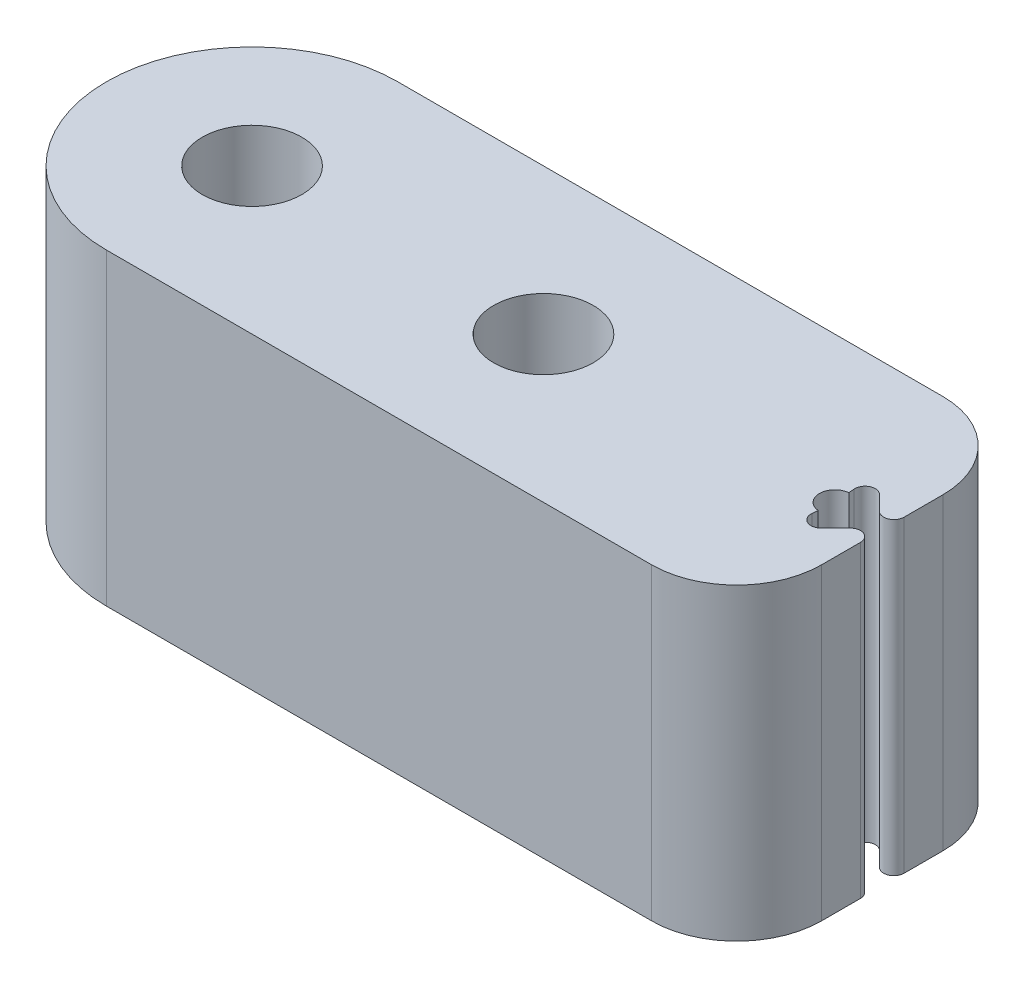
ISO-10303-21;
HEADER;
FILE_DESCRIPTION(('STEP AP214'),'2;1');
FILE_NAME('part.step','',(''),(''),'','','');
FILE_SCHEMA(('AUTOMOTIVE_DESIGN { 1 0 10303 214 1 1 1 1 }'));
ENDSEC;
DATA;
#1=APPLICATION_CONTEXT('core data for automotive mechanical design processes');
#2=APPLICATION_PROTOCOL_DEFINITION('international standard','automotive_design',2000,#1);
#3=PRODUCT_CONTEXT('',#1,'mechanical');
#4=PRODUCT('Part','Part','',(#3));
#5=PRODUCT_RELATED_PRODUCT_CATEGORY('part','',(#4));
#6=PRODUCT_DEFINITION_FORMATION('','',#4);
#7=PRODUCT_DEFINITION_CONTEXT('part definition',#1,'design');
#8=PRODUCT_DEFINITION('design','',#6,#7);
#9=PRODUCT_DEFINITION_SHAPE('','',#8);
#10=(LENGTH_UNIT() NAMED_UNIT(*) SI_UNIT(.MILLI.,.METRE.));
#11=(NAMED_UNIT(*) PLANE_ANGLE_UNIT() SI_UNIT($,.RADIAN.));
#12=(NAMED_UNIT(*) SI_UNIT($,.STERADIAN.) SOLID_ANGLE_UNIT());
#13=UNCERTAINTY_MEASURE_WITH_UNIT(LENGTH_MEASURE(1.E-05),#10,'distance_accuracy_value','');
#14=(GEOMETRIC_REPRESENTATION_CONTEXT(3) GLOBAL_UNCERTAINTY_ASSIGNED_CONTEXT((#13)) GLOBAL_UNIT_ASSIGNED_CONTEXT((#10,
#11,#12)) REPRESENTATION_CONTEXT('',''));
#15=CARTESIAN_POINT('',(0.,0.,0.));
#16=DIRECTION('',(0.,0.,1.));
#17=DIRECTION('',(1.,0.,0.));
#18=AXIS2_PLACEMENT_3D('',#15,#16,#17);
#19=CARTESIAN_POINT('',(-4.,12.7,0.));
#20=DIRECTION('',(0.,1.,0.));
#21=DIRECTION('',(0.,0.,1.));
#22=AXIS2_PLACEMENT_3D('',#19,#20,#21);
#23=PLANE('',#22);
#24=CARTESIAN_POINT('',(-16.,12.7,0.));
#25=DIRECTION('',(0.,1.,0.));
#26=DIRECTION('',(0.,0.,1.));
#27=AXIS2_PLACEMENT_3D('',#24,#25,#26);
#28=CIRCLE('',#27,2.05);
#29=CARTESIAN_POINT('',(-16.,12.7,2.05));
#30=VERTEX_POINT('',#29);
#31=EDGE_CURVE('E194',#30,#30,#28,.T.);
#32=ORIENTED_EDGE('',*,*,#31,.F.);
#33=EDGE_LOOP('',(#32));
#34=FACE_BOUND('',#33,.T.);
#35=CARTESIAN_POINT('',(-4.,12.7,0.));
#36=DIRECTION('',(0.,-1.,0.));
#37=DIRECTION('',(0.,0.,1.));
#38=AXIS2_PLACEMENT_3D('',#35,#36,#37);
#39=CIRCLE('',#38,0.634999999999999);
#40=CARTESIAN_POINT('',(-4.05534389664477,12.7,0.632583633288258));
#41=VERTEX_POINT('',#40);
#42=CARTESIAN_POINT('',(-4.05534389664477,12.7,-0.632583633288257));
#43=VERTEX_POINT('',#42);
#44=EDGE_CURVE('E236',#41,#43,#39,.T.);
#45=ORIENTED_EDGE('',*,*,#44,.T.);
#46=DIRECTION('',(-0.0871557427476667,0.,-0.996194698091745));
#47=VECTOR('',#46,1.);
#48=CARTESIAN_POINT('',(-4.05534389664477,12.7,-0.632583633288257));
#49=LINE('',#48,#47);
#50=CARTESIAN_POINT('',(-4.07584445948414,12.7,-0.866906138778301));
#51=VERTEX_POINT('',#50);
#52=EDGE_CURVE('E124',#43,#51,#49,.T.);
#53=ORIENTED_EDGE('',*,*,#52,.T.);
#54=CARTESIAN_POINT('',(-3.65806528884882,12.7,-0.903457080066159));
#55=DIRECTION('',(0.,-1.,0.));
#56=DIRECTION('',(0.,0.,-1.));
#57=AXIS2_PLACEMENT_3D('',#54,#55,#56);
#58=CIRCLE('',#57,0.419375019196146);
#59=CARTESIAN_POINT('',(-3.36152236891499,12.7,-1.2));
#60=VERTEX_POINT('',#59);
#61=EDGE_CURVE('E289',#51,#60,#58,.T.);
#62=ORIENTED_EDGE('',*,*,#61,.T.);
#63=DIRECTION('',(0.707106781186566,0.,0.707106781186529));
#64=VECTOR('',#63,1.);
#65=CARTESIAN_POINT('',(-3.36152236891499,12.7,-1.2));
#66=LINE('',#65,#64);
#67=CARTESIAN_POINT('',(-2.76152236891496,12.7,-0.6));
#68=VERTEX_POINT('',#67);
#69=EDGE_CURVE('E309',#60,#68,#66,.T.);
#70=ORIENTED_EDGE('',*,*,#69,.T.);
#71=CARTESIAN_POINT('',(-2.46497944898113,12.7,-0.89654291993384));
#72=DIRECTION('',(0.,1.,0.));
#73=DIRECTION('',(0.,0.,1.));
#74=AXIS2_PLACEMENT_3D('',#71,#72,#73);
#75=CIRCLE('',#74,0.419375019196146);
#76=CARTESIAN_POINT('',(-2.04560442978499,12.7,-0.89654291993384));
#77=VERTEX_POINT('',#76);
#78=EDGE_CURVE('E305',#68,#77,#75,.T.);
#79=ORIENTED_EDGE('',*,*,#78,.T.);
#80=DIRECTION('',(0.,0.,-1.));
#81=VECTOR('',#80,1.);
#82=CARTESIAN_POINT('',(-2.04560442978499,12.7,-0.89654291993384));
#83=LINE('',#82,#81);
#84=CARTESIAN_POINT('',(-2.04560442978499,12.7,-2.5));
#85=VERTEX_POINT('',#84);
#86=EDGE_CURVE('E308',#77,#85,#83,.T.);
#87=ORIENTED_EDGE('',*,*,#86,.T.);
#88=CARTESIAN_POINT('',(-5.54560442978499,12.7,-2.5));
#89=DIRECTION('',(0.,1.,0.));
#90=DIRECTION('',(0.,0.,1.));
#91=AXIS2_PLACEMENT_3D('',#88,#89,#90);
#92=CIRCLE('',#91,3.5);
#93=CARTESIAN_POINT('',(-5.54560442978499,12.7,-6.));
#94=VERTEX_POINT('',#93);
#95=EDGE_CURVE('E313',#85,#94,#92,.T.);
#96=ORIENTED_EDGE('',*,*,#95,.T.);
#97=DIRECTION('',(-1.,0.,0.));
#98=VECTOR('',#97,1.);
#99=CARTESIAN_POINT('',(-5.54560442978499,12.7,-6.));
#100=LINE('',#99,#98);
#101=CARTESIAN_POINT('',(-28.,12.7,-6.));
#102=VERTEX_POINT('',#101);
#103=EDGE_CURVE('E320',#94,#102,#100,.T.);
#104=ORIENTED_EDGE('',*,*,#103,.T.);
#105=CARTESIAN_POINT('',(-28.,12.7,0.));
#106=DIRECTION('',(0.,1.,0.));
#107=DIRECTION('',(0.,0.,1.));
#108=AXIS2_PLACEMENT_3D('',#105,#106,#107);
#109=CIRCLE('',#108,6.);
#110=CARTESIAN_POINT('',(-28.,12.7,6.));
#111=VERTEX_POINT('',#110);
#112=EDGE_CURVE('E323',#102,#111,#109,.T.);
#113=ORIENTED_EDGE('',*,*,#112,.T.);
#114=DIRECTION('',(1.,0.,0.));
#115=VECTOR('',#114,1.);
#116=CARTESIAN_POINT('',(-28.,12.7,6.));
#117=LINE('',#116,#115);
#118=CARTESIAN_POINT('',(-5.54560442978499,12.7,6.));
#119=VERTEX_POINT('',#118);
#120=EDGE_CURVE('E326',#111,#119,#117,.T.);
#121=ORIENTED_EDGE('',*,*,#120,.T.);
#122=CARTESIAN_POINT('',(-5.54560442978499,12.7,2.5));
#123=DIRECTION('',(0.,1.,0.));
#124=DIRECTION('',(0.,0.,1.));
#125=AXIS2_PLACEMENT_3D('',#122,#123,#124);
#126=CIRCLE('',#125,3.5);
#127=CARTESIAN_POINT('',(-2.04560442978499,12.7,2.5));
#128=VERTEX_POINT('',#127);
#129=EDGE_CURVE('E329',#119,#128,#126,.T.);
#130=ORIENTED_EDGE('',*,*,#129,.T.);
#131=DIRECTION('',(0.,0.,-1.));
#132=VECTOR('',#131,1.);
#133=CARTESIAN_POINT('',(-2.04560442978499,12.7,0.896542919933841));
#134=LINE('',#133,#132);
#135=CARTESIAN_POINT('',(-2.04560442978499,12.7,0.896542919933841));
#136=VERTEX_POINT('',#135);
#137=EDGE_CURVE('E332',#128,#136,#134,.T.);
#138=ORIENTED_EDGE('',*,*,#137,.T.);
#139=CARTESIAN_POINT('',(-2.46497944898113,12.7,0.896542919933841));
#140=DIRECTION('',(0.,1.,0.));
#141=DIRECTION('',(0.,0.,-1.));
#142=AXIS2_PLACEMENT_3D('',#139,#140,#141);
#143=CIRCLE('',#142,0.419375019196146);
#144=CARTESIAN_POINT('',(-2.76152236891496,12.7,0.6));
#145=VERTEX_POINT('',#144);
#146=EDGE_CURVE('E167',#136,#145,#143,.T.);
#147=ORIENTED_EDGE('',*,*,#146,.T.);
#148=DIRECTION('',(-0.707106781186565,0.,0.70710678118653));
#149=VECTOR('',#148,1.);
#150=CARTESIAN_POINT('',(-3.36152236891499,12.7,1.2));
#151=LINE('',#150,#149);
#152=CARTESIAN_POINT('',(-3.36152236891499,12.7,1.2));
#153=VERTEX_POINT('',#152);
#154=EDGE_CURVE('E161',#145,#153,#151,.T.);
#155=ORIENTED_EDGE('',*,*,#154,.T.);
#156=CARTESIAN_POINT('',(-3.65806528884882,12.7,0.903457080066159));
#157=DIRECTION('',(0.,-1.,0.));
#158=DIRECTION('',(0.,0.,1.));
#159=AXIS2_PLACEMENT_3D('',#156,#157,#158);
#160=CIRCLE('',#159,0.419375019196146);
#161=CARTESIAN_POINT('',(-4.07584445948414,12.7,0.866906138778302));
#162=VERTEX_POINT('',#161);
#163=EDGE_CURVE('E165',#153,#162,#160,.T.);
#164=ORIENTED_EDGE('',*,*,#163,.T.);
#165=DIRECTION('',(0.0871557427476667,0.,-0.996194698091745));
#166=VECTOR('',#165,1.);
#167=CARTESIAN_POINT('',(-4.05534389664477,12.7,0.632583633288258));
#168=LINE('',#167,#166);
#169=EDGE_CURVE('E57',#162,#41,#168,.T.);
#170=ORIENTED_EDGE('',*,*,#169,.T.);
#171=EDGE_LOOP('',(#45,#53,#62,#70,#79,#87,#96,#104,#113,#121,#130,#138,#147,#155,#164,#170));
#172=FACE_BOUND('',#171,.T.);
#173=CARTESIAN_POINT('',(-28.,12.7,0.));
#174=DIRECTION('',(0.,1.,0.));
#175=DIRECTION('',(0.,0.,1.));
#176=AXIS2_PLACEMENT_3D('',#173,#174,#175);
#177=CIRCLE('',#176,2.05);
#178=CARTESIAN_POINT('',(-28.,12.7,2.05));
#179=VERTEX_POINT('',#178);
#180=EDGE_CURVE('E376',#179,#179,#177,.T.);
#181=ORIENTED_EDGE('',*,*,#180,.F.);
#182=EDGE_LOOP('',(#181));
#183=FACE_BOUND('',#182,.T.);
#184=ADVANCED_FACE('F39',(#34,#172,#183),#23,.T.);
#185=CARTESIAN_POINT('',(-4.,0.,0.));
#186=DIRECTION('',(0.,1.,0.));
#187=DIRECTION('',(0.,0.,1.));
#188=AXIS2_PLACEMENT_3D('',#185,#186,#187);
#189=PLANE('',#188);
#190=CARTESIAN_POINT('',(-4.,0.,0.));
#191=DIRECTION('',(0.,-1.,0.));
#192=DIRECTION('',(0.,0.,1.));
#193=AXIS2_PLACEMENT_3D('',#190,#191,#192);
#194=CIRCLE('',#193,0.634999999999999);
#195=CARTESIAN_POINT('',(-4.05534389664477,0.,0.632583633288258));
#196=VERTEX_POINT('',#195);
#197=CARTESIAN_POINT('',(-4.05534389664477,0.,-0.632583633288257));
#198=VERTEX_POINT('',#197);
#199=EDGE_CURVE('E189',#196,#198,#194,.T.);
#200=ORIENTED_EDGE('',*,*,#199,.F.);
#201=DIRECTION('',(0.0871557427476667,0.,-0.996194698091745));
#202=VECTOR('',#201,1.);
#203=CARTESIAN_POINT('',(-4.05534389664477,0.,0.632583633288258));
#204=LINE('',#203,#202);
#205=CARTESIAN_POINT('',(-4.07584445948414,0.,0.866906138778302));
#206=VERTEX_POINT('',#205);
#207=EDGE_CURVE('E116',#206,#196,#204,.T.);
#208=ORIENTED_EDGE('',*,*,#207,.F.);
#209=CARTESIAN_POINT('',(-3.65806528884882,0.,0.903457080066159));
#210=DIRECTION('',(0.,-1.,0.));
#211=DIRECTION('',(0.,0.,1.));
#212=AXIS2_PLACEMENT_3D('',#209,#210,#211);
#213=CIRCLE('',#212,0.419375019196146);
#214=CARTESIAN_POINT('',(-3.36152236891499,0.,1.2));
#215=VERTEX_POINT('',#214);
#216=EDGE_CURVE('E110',#215,#206,#213,.T.);
#217=ORIENTED_EDGE('',*,*,#216,.F.);
#218=DIRECTION('',(-0.707106781186565,0.,0.70710678118653));
#219=VECTOR('',#218,1.);
#220=CARTESIAN_POINT('',(-3.36152236891499,0.,1.2));
#221=LINE('',#220,#219);
#222=CARTESIAN_POINT('',(-2.76152236891496,0.,0.6));
#223=VERTEX_POINT('',#222);
#224=EDGE_CURVE('E176',#223,#215,#221,.T.);
#225=ORIENTED_EDGE('',*,*,#224,.F.);
#226=CARTESIAN_POINT('',(-2.46497944898113,0.,0.896542919933841));
#227=DIRECTION('',(0.,1.,0.));
#228=DIRECTION('',(0.,0.,-1.));
#229=AXIS2_PLACEMENT_3D('',#226,#227,#228);
#230=CIRCLE('',#229,0.419375019196146);
#231=CARTESIAN_POINT('',(-2.04560442978499,0.,0.896542919933841));
#232=VERTEX_POINT('',#231);
#233=EDGE_CURVE('E227',#232,#223,#230,.T.);
#234=ORIENTED_EDGE('',*,*,#233,.F.);
#235=DIRECTION('',(0.,0.,-1.));
#236=VECTOR('',#235,1.);
#237=CARTESIAN_POINT('',(-2.04560442978499,0.,0.896542919933841));
#238=LINE('',#237,#236);
#239=CARTESIAN_POINT('',(-2.04560442978499,0.,2.5));
#240=VERTEX_POINT('',#239);
#241=EDGE_CURVE('E224',#240,#232,#238,.T.);
#242=ORIENTED_EDGE('',*,*,#241,.F.);
#243=CARTESIAN_POINT('',(-5.54560442978499,0.,2.5));
#244=DIRECTION('',(0.,1.,0.));
#245=DIRECTION('',(0.,0.,1.));
#246=AXIS2_PLACEMENT_3D('',#243,#244,#245);
#247=CIRCLE('',#246,3.5);
#248=CARTESIAN_POINT('',(-5.54560442978499,0.,6.));
#249=VERTEX_POINT('',#248);
#250=EDGE_CURVE('E221',#249,#240,#247,.T.);
#251=ORIENTED_EDGE('',*,*,#250,.F.);
#252=DIRECTION('',(1.,0.,0.));
#253=VECTOR('',#252,1.);
#254=CARTESIAN_POINT('',(-28.,0.,6.));
#255=LINE('',#254,#253);
#256=CARTESIAN_POINT('',(-28.,0.,6.));
#257=VERTEX_POINT('',#256);
#258=EDGE_CURVE('E218',#257,#249,#255,.T.);
#259=ORIENTED_EDGE('',*,*,#258,.F.);
#260=CARTESIAN_POINT('',(-28.,0.,0.));
#261=DIRECTION('',(0.,1.,0.));
#262=DIRECTION('',(0.,0.,1.));
#263=AXIS2_PLACEMENT_3D('',#260,#261,#262);
#264=CIRCLE('',#263,6.);
#265=CARTESIAN_POINT('',(-28.,0.,-6.));
#266=VERTEX_POINT('',#265);
#267=EDGE_CURVE('E215',#266,#257,#264,.T.);
#268=ORIENTED_EDGE('',*,*,#267,.F.);
#269=DIRECTION('',(-1.,0.,0.));
#270=VECTOR('',#269,1.);
#271=CARTESIAN_POINT('',(-5.54560442978499,0.,-6.));
#272=LINE('',#271,#270);
#273=CARTESIAN_POINT('',(-5.54560442978499,0.,-6.));
#274=VERTEX_POINT('',#273);
#275=EDGE_CURVE('E212',#274,#266,#272,.T.);
#276=ORIENTED_EDGE('',*,*,#275,.F.);
#277=CARTESIAN_POINT('',(-5.54560442978499,0.,-2.5));
#278=DIRECTION('',(0.,1.,0.));
#279=DIRECTION('',(0.,0.,1.));
#280=AXIS2_PLACEMENT_3D('',#277,#278,#279);
#281=CIRCLE('',#280,3.5);
#282=CARTESIAN_POINT('',(-2.04560442978499,0.,-2.5));
#283=VERTEX_POINT('',#282);
#284=EDGE_CURVE('E209',#283,#274,#281,.T.);
#285=ORIENTED_EDGE('',*,*,#284,.F.);
#286=DIRECTION('',(0.,0.,-1.));
#287=VECTOR('',#286,1.);
#288=CARTESIAN_POINT('',(-2.04560442978499,0.,-0.89654291993384));
#289=LINE('',#288,#287);
#290=CARTESIAN_POINT('',(-2.04560442978499,0.,-0.89654291993384));
#291=VERTEX_POINT('',#290);
#292=EDGE_CURVE('E206',#291,#283,#289,.T.);
#293=ORIENTED_EDGE('',*,*,#292,.F.);
#294=CARTESIAN_POINT('',(-2.46497944898113,0.,-0.89654291993384));
#295=DIRECTION('',(0.,1.,0.));
#296=DIRECTION('',(0.,0.,1.));
#297=AXIS2_PLACEMENT_3D('',#294,#295,#296);
#298=CIRCLE('',#297,0.419375019196146);
#299=CARTESIAN_POINT('',(-2.76152236891496,0.,-0.6));
#300=VERTEX_POINT('',#299);
#301=EDGE_CURVE('E203',#300,#291,#298,.T.);
#302=ORIENTED_EDGE('',*,*,#301,.F.);
#303=DIRECTION('',(0.707106781186566,0.,0.707106781186529));
#304=VECTOR('',#303,1.);
#305=CARTESIAN_POINT('',(-3.36152236891499,0.,-1.2));
#306=LINE('',#305,#304);
#307=CARTESIAN_POINT('',(-3.36152236891499,0.,-1.2));
#308=VERTEX_POINT('',#307);
#309=EDGE_CURVE('E200',#308,#300,#306,.T.);
#310=ORIENTED_EDGE('',*,*,#309,.F.);
#311=CARTESIAN_POINT('',(-3.65806528884882,0.,-0.903457080066159));
#312=DIRECTION('',(0.,-1.,0.));
#313=DIRECTION('',(0.,0.,-1.));
#314=AXIS2_PLACEMENT_3D('',#311,#312,#313);
#315=CIRCLE('',#314,0.419375019196146);
#316=CARTESIAN_POINT('',(-4.07584445948414,0.,-0.866906138778301));
#317=VERTEX_POINT('',#316);
#318=EDGE_CURVE('E197',#317,#308,#315,.T.);
#319=ORIENTED_EDGE('',*,*,#318,.F.);
#320=DIRECTION('',(-0.0871557427476667,0.,-0.996194698091745));
#321=VECTOR('',#320,1.);
#322=CARTESIAN_POINT('',(-4.05534389664477,0.,-0.632583633288257));
#323=LINE('',#322,#321);
#324=EDGE_CURVE('E193',#198,#317,#323,.T.);
#325=ORIENTED_EDGE('',*,*,#324,.F.);
#326=EDGE_LOOP('',(#200,#208,#217,#225,#234,#242,#251,#259,#268,#276,#285,#293,#302,#310,#319,#325));
#327=FACE_BOUND('',#326,.T.);
#328=CARTESIAN_POINT('',(-16.,0.,0.));
#329=DIRECTION('',(0.,1.,0.));
#330=DIRECTION('',(0.,0.,1.));
#331=AXIS2_PLACEMENT_3D('',#328,#329,#330);
#332=CIRCLE('',#331,2.05);
#333=CARTESIAN_POINT('',(-16.,0.,2.05));
#334=VERTEX_POINT('',#333);
#335=EDGE_CURVE('E384',#334,#334,#332,.T.);
#336=ORIENTED_EDGE('',*,*,#335,.T.);
#337=EDGE_LOOP('',(#336));
#338=FACE_BOUND('',#337,.T.);
#339=CARTESIAN_POINT('',(-28.,0.,0.));
#340=DIRECTION('',(0.,1.,0.));
#341=DIRECTION('',(0.,0.,1.));
#342=AXIS2_PLACEMENT_3D('',#339,#340,#341);
#343=CIRCLE('',#342,2.05);
#344=CARTESIAN_POINT('',(-28.,0.,2.05));
#345=VERTEX_POINT('',#344);
#346=EDGE_CURVE('E379',#345,#345,#343,.T.);
#347=ORIENTED_EDGE('',*,*,#346,.T.);
#348=EDGE_LOOP('',(#347));
#349=FACE_BOUND('',#348,.T.);
#350=ADVANCED_FACE('F293',(#327,#338,#349),#189,.F.);
#351=CARTESIAN_POINT('',(-4.,12.7,0.));
#352=DIRECTION('',(0.,-1.,0.));
#353=DIRECTION('',(0.,0.,-1.));
#354=AXIS2_PLACEMENT_3D('',#351,#352,#353);
#355=CYLINDRICAL_SURFACE('',#354,0.634999999999999);
#356=ORIENTED_EDGE('',*,*,#199,.T.);
#357=DIRECTION('',(0.,-1.,0.));
#358=VECTOR('',#357,1.);
#359=CARTESIAN_POINT('',(-4.05534389664477,12.7,-0.632583633288257));
#360=LINE('',#359,#358);
#361=EDGE_CURVE('E11',#43,#198,#360,.T.);
#362=ORIENTED_EDGE('',*,*,#361,.F.);
#363=ORIENTED_EDGE('',*,*,#44,.F.);
#364=DIRECTION('',(0.,-1.,0.));
#365=VECTOR('',#364,1.);
#366=CARTESIAN_POINT('',(-4.05534389664477,12.7,0.632583633288258));
#367=LINE('',#366,#365);
#368=EDGE_CURVE('E185',#41,#196,#367,.T.);
#369=ORIENTED_EDGE('',*,*,#368,.T.);
#370=EDGE_LOOP('',(#356,#362,#363,#369));
#371=FACE_BOUND('',#370,.T.);
#372=ADVANCED_FACE('F41',(#371),#355,.F.);
#373=CARTESIAN_POINT('',(-4.05534389664477,12.7,-0.632583633288257));
#374=DIRECTION('',(-0.996194698091745,0.,0.0871557427476667));
#375=DIRECTION('',(0.0871557427476667,0.,0.996194698091745));
#376=AXIS2_PLACEMENT_3D('',#373,#374,#375);
#377=PLANE('',#376);
#378=ORIENTED_EDGE('',*,*,#324,.T.);
#379=DIRECTION('',(0.,-1.,0.));
#380=VECTOR('',#379,1.);
#381=CARTESIAN_POINT('',(-4.07584445948414,12.7,-0.866906138778301));
#382=LINE('',#381,#380);
#383=EDGE_CURVE('E49',#51,#317,#382,.T.);
#384=ORIENTED_EDGE('',*,*,#383,.F.);
#385=ORIENTED_EDGE('',*,*,#52,.F.);
#386=ORIENTED_EDGE('',*,*,#361,.T.);
#387=EDGE_LOOP('',(#378,#384,#385,#386));
#388=FACE_BOUND('',#387,.T.);
#389=ADVANCED_FACE('F522',(#388),#377,.F.);
#390=CARTESIAN_POINT('',(-3.65806528884882,12.7,-0.903457080066159));
#391=DIRECTION('',(0.,-1.,0.));
#392=DIRECTION('',(0.,0.,-1.));
#393=AXIS2_PLACEMENT_3D('',#390,#391,#392);
#394=CYLINDRICAL_SURFACE('',#393,0.419375019196146);
#395=ORIENTED_EDGE('',*,*,#318,.T.);
#396=DIRECTION('',(0.,-1.,0.));
#397=VECTOR('',#396,1.);
#398=CARTESIAN_POINT('',(-3.36152236891499,12.7,-1.2));
#399=LINE('',#398,#397);
#400=EDGE_CURVE('E279',#60,#308,#399,.T.);
#401=ORIENTED_EDGE('',*,*,#400,.F.);
#402=ORIENTED_EDGE('',*,*,#61,.F.);
#403=ORIENTED_EDGE('',*,*,#383,.T.);
#404=EDGE_LOOP('',(#395,#401,#402,#403));
#405=FACE_BOUND('',#404,.T.);
#406=ADVANCED_FACE('F287',(#405),#394,.F.);
#407=CARTESIAN_POINT('',(-3.36152236891499,12.7,-1.2));
#408=DIRECTION('',(0.707106781186529,0.,-0.707106781186566));
#409=DIRECTION('',(-0.707106781186566,0.,-0.707106781186529));
#410=AXIS2_PLACEMENT_3D('',#407,#408,#409);
#411=PLANE('',#410);
#412=ORIENTED_EDGE('',*,*,#309,.T.);
#413=DIRECTION('',(0.,-1.,0.));
#414=VECTOR('',#413,1.);
#415=CARTESIAN_POINT('',(-2.76152236891496,12.7,-0.6));
#416=LINE('',#415,#414);
#417=EDGE_CURVE('E275',#68,#300,#416,.T.);
#418=ORIENTED_EDGE('',*,*,#417,.F.);
#419=ORIENTED_EDGE('',*,*,#69,.F.);
#420=ORIENTED_EDGE('',*,*,#400,.T.);
#421=EDGE_LOOP('',(#412,#418,#419,#420));
#422=FACE_BOUND('',#421,.T.);
#423=ADVANCED_FACE('F299',(#422),#411,.F.);
#424=CARTESIAN_POINT('',(-2.46497944898113,12.7,-0.89654291993384));
#425=DIRECTION('',(0.,-1.,0.));
#426=DIRECTION('',(0.,0.,-1.));
#427=AXIS2_PLACEMENT_3D('',#424,#425,#426);
#428=CYLINDRICAL_SURFACE('',#427,0.419375019196146);
#429=ORIENTED_EDGE('',*,*,#301,.T.);
#430=DIRECTION('',(0.,-1.,0.));
#431=VECTOR('',#430,1.);
#432=CARTESIAN_POINT('',(-2.04560442978499,12.7,-0.89654291993384));
#433=LINE('',#432,#431);
#434=EDGE_CURVE('E271',#77,#291,#433,.T.);
#435=ORIENTED_EDGE('',*,*,#434,.F.);
#436=ORIENTED_EDGE('',*,*,#78,.F.);
#437=ORIENTED_EDGE('',*,*,#417,.T.);
#438=EDGE_LOOP('',(#429,#435,#436,#437));
#439=FACE_BOUND('',#438,.T.);
#440=ADVANCED_FACE('F303',(#439),#428,.T.);
#441=CARTESIAN_POINT('',(-2.04560442978499,12.7,-0.89654291993384));
#442=DIRECTION('',(-1.,0.,0.));
#443=DIRECTION('',(0.,0.,1.));
#444=AXIS2_PLACEMENT_3D('',#441,#442,#443);
#445=PLANE('',#444);
#446=ORIENTED_EDGE('',*,*,#292,.T.);
#447=DIRECTION('',(0.,-1.,0.));
#448=VECTOR('',#447,1.);
#449=CARTESIAN_POINT('',(-2.04560442978499,12.7,-2.5));
#450=LINE('',#449,#448);
#451=EDGE_CURVE('E267',#85,#283,#450,.T.);
#452=ORIENTED_EDGE('',*,*,#451,.F.);
#453=ORIENTED_EDGE('',*,*,#86,.F.);
#454=ORIENTED_EDGE('',*,*,#434,.T.);
#455=EDGE_LOOP('',(#446,#452,#453,#454));
#456=FACE_BOUND('',#455,.T.);
#457=ADVANCED_FACE('F487',(#456),#445,.F.);
#458=CARTESIAN_POINT('',(-5.54560442978499,12.7,-2.5));
#459=DIRECTION('',(0.,-1.,0.));
#460=DIRECTION('',(0.,0.,-1.));
#461=AXIS2_PLACEMENT_3D('',#458,#459,#460);
#462=CYLINDRICAL_SURFACE('',#461,3.5);
#463=ORIENTED_EDGE('',*,*,#284,.T.);
#464=DIRECTION('',(0.,-1.,0.));
#465=VECTOR('',#464,1.);
#466=CARTESIAN_POINT('',(-5.54560442978499,12.7,-6.));
#467=LINE('',#466,#465);
#468=EDGE_CURVE('E263',#94,#274,#467,.T.);
#469=ORIENTED_EDGE('',*,*,#468,.F.);
#470=ORIENTED_EDGE('',*,*,#95,.F.);
#471=ORIENTED_EDGE('',*,*,#451,.T.);
#472=EDGE_LOOP('',(#463,#469,#470,#471));
#473=FACE_BOUND('',#472,.T.);
#474=ADVANCED_FACE('F477',(#473),#462,.T.);
#475=CARTESIAN_POINT('',(-5.54560442978499,12.7,-6.));
#476=DIRECTION('',(0.,0.,1.));
#477=DIRECTION('',(1.,0.,0.));
#478=AXIS2_PLACEMENT_3D('',#475,#476,#477);
#479=PLANE('',#478);
#480=ORIENTED_EDGE('',*,*,#275,.T.);
#481=DIRECTION('',(0.,-1.,0.));
#482=VECTOR('',#481,1.);
#483=CARTESIAN_POINT('',(-28.,12.7,-6.));
#484=LINE('',#483,#482);
#485=EDGE_CURVE('E259',#102,#266,#484,.T.);
#486=ORIENTED_EDGE('',*,*,#485,.F.);
#487=ORIENTED_EDGE('',*,*,#103,.F.);
#488=ORIENTED_EDGE('',*,*,#468,.T.);
#489=EDGE_LOOP('',(#480,#486,#487,#488));
#490=FACE_BOUND('',#489,.T.);
#491=ADVANCED_FACE('F467',(#490),#479,.F.);
#492=CARTESIAN_POINT('',(-28.,12.7,0.));
#493=DIRECTION('',(0.,-1.,0.));
#494=DIRECTION('',(0.,0.,-1.));
#495=AXIS2_PLACEMENT_3D('',#492,#493,#494);
#496=CYLINDRICAL_SURFACE('',#495,6.);
#497=ORIENTED_EDGE('',*,*,#267,.T.);
#498=DIRECTION('',(0.,-1.,0.));
#499=VECTOR('',#498,1.);
#500=CARTESIAN_POINT('',(-28.,12.7,6.));
#501=LINE('',#500,#499);
#502=EDGE_CURVE('E255',#111,#257,#501,.T.);
#503=ORIENTED_EDGE('',*,*,#502,.F.);
#504=ORIENTED_EDGE('',*,*,#112,.F.);
#505=ORIENTED_EDGE('',*,*,#485,.T.);
#506=EDGE_LOOP('',(#497,#503,#504,#505));
#507=FACE_BOUND('',#506,.T.);
#508=ADVANCED_FACE('F457',(#507),#496,.T.);
#509=CARTESIAN_POINT('',(-28.,12.7,6.));
#510=DIRECTION('',(0.,0.,-1.));
#511=DIRECTION('',(-1.,0.,0.));
#512=AXIS2_PLACEMENT_3D('',#509,#510,#511);
#513=PLANE('',#512);
#514=ORIENTED_EDGE('',*,*,#258,.T.);
#515=DIRECTION('',(0.,-1.,0.));
#516=VECTOR('',#515,1.);
#517=CARTESIAN_POINT('',(-5.54560442978499,12.7,6.));
#518=LINE('',#517,#516);
#519=EDGE_CURVE('E251',#119,#249,#518,.T.);
#520=ORIENTED_EDGE('',*,*,#519,.F.);
#521=ORIENTED_EDGE('',*,*,#120,.F.);
#522=ORIENTED_EDGE('',*,*,#502,.T.);
#523=EDGE_LOOP('',(#514,#520,#521,#522));
#524=FACE_BOUND('',#523,.T.);
#525=ADVANCED_FACE('F447',(#524),#513,.F.);
#526=CARTESIAN_POINT('',(-5.54560442978499,12.7,2.5));
#527=DIRECTION('',(0.,-1.,0.));
#528=DIRECTION('',(0.,0.,-1.));
#529=AXIS2_PLACEMENT_3D('',#526,#527,#528);
#530=CYLINDRICAL_SURFACE('',#529,3.5);
#531=ORIENTED_EDGE('',*,*,#250,.T.);
#532=DIRECTION('',(0.,-1.,0.));
#533=VECTOR('',#532,1.);
#534=CARTESIAN_POINT('',(-2.04560442978499,12.7,2.5));
#535=LINE('',#534,#533);
#536=EDGE_CURVE('E247',#128,#240,#535,.T.);
#537=ORIENTED_EDGE('',*,*,#536,.F.);
#538=ORIENTED_EDGE('',*,*,#129,.F.);
#539=ORIENTED_EDGE('',*,*,#519,.T.);
#540=EDGE_LOOP('',(#531,#537,#538,#539));
#541=FACE_BOUND('',#540,.T.);
#542=ADVANCED_FACE('F438',(#541),#530,.T.);
#543=CARTESIAN_POINT('',(-2.04560442978499,12.7,0.896542919933841));
#544=DIRECTION('',(-1.,0.,0.));
#545=DIRECTION('',(0.,0.,1.));
#546=AXIS2_PLACEMENT_3D('',#543,#544,#545);
#547=PLANE('',#546);
#548=ORIENTED_EDGE('',*,*,#241,.T.);
#549=DIRECTION('',(0.,-1.,0.));
#550=VECTOR('',#549,1.);
#551=CARTESIAN_POINT('',(-2.04560442978499,12.7,0.896542919933841));
#552=LINE('',#551,#550);
#553=EDGE_CURVE('E243',#136,#232,#552,.T.);
#554=ORIENTED_EDGE('',*,*,#553,.F.);
#555=ORIENTED_EDGE('',*,*,#137,.F.);
#556=ORIENTED_EDGE('',*,*,#536,.T.);
#557=EDGE_LOOP('',(#548,#554,#555,#556));
#558=FACE_BOUND('',#557,.T.);
#559=ADVANCED_FACE('F340',(#558),#547,.F.);
#560=CARTESIAN_POINT('',(-2.46497944898113,12.7,0.896542919933841));
#561=DIRECTION('',(0.,-1.,0.));
#562=DIRECTION('',(0.,0.,-1.));
#563=AXIS2_PLACEMENT_3D('',#560,#561,#562);
#564=CYLINDRICAL_SURFACE('',#563,0.419375019196146);
#565=ORIENTED_EDGE('',*,*,#233,.T.);
#566=DIRECTION('',(0.,-1.,0.));
#567=VECTOR('',#566,1.);
#568=CARTESIAN_POINT('',(-2.76152236891496,12.7,0.6));
#569=LINE('',#568,#567);
#570=EDGE_CURVE('E178',#145,#223,#569,.T.);
#571=ORIENTED_EDGE('',*,*,#570,.F.);
#572=ORIENTED_EDGE('',*,*,#146,.F.);
#573=ORIENTED_EDGE('',*,*,#553,.T.);
#574=EDGE_LOOP('',(#565,#571,#572,#573));
#575=FACE_BOUND('',#574,.T.);
#576=ADVANCED_FACE('F344',(#575),#564,.T.);
#577=CARTESIAN_POINT('',(-3.36152236891499,12.7,1.2));
#578=DIRECTION('',(0.70710678118653,0.,0.707106781186565));
#579=DIRECTION('',(0.707106781186565,0.,-0.70710678118653));
#580=AXIS2_PLACEMENT_3D('',#577,#578,#579);
#581=PLANE('',#580);
#582=ORIENTED_EDGE('',*,*,#224,.T.);
#583=DIRECTION('',(0.,-1.,0.));
#584=VECTOR('',#583,1.);
#585=CARTESIAN_POINT('',(-3.36152236891499,12.7,1.2));
#586=LINE('',#585,#584);
#587=EDGE_CURVE('E173',#153,#215,#586,.T.);
#588=ORIENTED_EDGE('',*,*,#587,.F.);
#589=ORIENTED_EDGE('',*,*,#154,.F.);
#590=ORIENTED_EDGE('',*,*,#570,.T.);
#591=EDGE_LOOP('',(#582,#588,#589,#590));
#592=FACE_BOUND('',#591,.T.);
#593=ADVANCED_FACE('F174',(#592),#581,.F.);
#594=CARTESIAN_POINT('',(-3.65806528884882,12.7,0.903457080066159));
#595=DIRECTION('',(0.,-1.,0.));
#596=DIRECTION('',(0.,0.,-1.));
#597=AXIS2_PLACEMENT_3D('',#594,#595,#596);
#598=CYLINDRICAL_SURFACE('',#597,0.419375019196146);
#599=ORIENTED_EDGE('',*,*,#216,.T.);
#600=DIRECTION('',(0.,-1.,0.));
#601=VECTOR('',#600,1.);
#602=CARTESIAN_POINT('',(-4.07584445948414,12.7,0.866906138778302));
#603=LINE('',#602,#601);
#604=EDGE_CURVE('E179',#162,#206,#603,.T.);
#605=ORIENTED_EDGE('',*,*,#604,.F.);
#606=ORIENTED_EDGE('',*,*,#163,.F.);
#607=ORIENTED_EDGE('',*,*,#587,.T.);
#608=EDGE_LOOP('',(#599,#605,#606,#607));
#609=FACE_BOUND('',#608,.T.);
#610=ADVANCED_FACE('F181',(#609),#598,.F.);
#611=CARTESIAN_POINT('',(-4.05534389664477,12.7,0.632583633288258));
#612=DIRECTION('',(-0.996194698091745,0.,-0.0871557427476667));
#613=DIRECTION('',(-0.0871557427476667,0.,0.996194698091745));
#614=AXIS2_PLACEMENT_3D('',#611,#612,#613);
#615=PLANE('',#614);
#616=ORIENTED_EDGE('',*,*,#207,.T.);
#617=ORIENTED_EDGE('',*,*,#368,.F.);
#618=ORIENTED_EDGE('',*,*,#169,.F.);
#619=ORIENTED_EDGE('',*,*,#604,.T.);
#620=EDGE_LOOP('',(#616,#617,#618,#619));
#621=FACE_BOUND('',#620,.T.);
#622=ADVANCED_FACE('F348',(#621),#615,.F.);
#623=CARTESIAN_POINT('',(-16.,12.7,0.));
#624=DIRECTION('',(0.,-1.,0.));
#625=DIRECTION('',(0.,0.,-1.));
#626=AXIS2_PLACEMENT_3D('',#623,#624,#625);
#627=CYLINDRICAL_SURFACE('',#626,2.05);
#628=ORIENTED_EDGE('',*,*,#31,.T.);
#629=EDGE_LOOP('',(#628));
#630=FACE_BOUND('',#629,.T.);
#631=ORIENTED_EDGE('',*,*,#335,.F.);
#632=EDGE_LOOP('',(#631));
#633=FACE_BOUND('',#632,.T.);
#634=ADVANCED_FACE('F350',(#630,#633),#627,.F.);
#635=CARTESIAN_POINT('',(-28.,12.7,0.));
#636=DIRECTION('',(0.,-1.,0.));
#637=DIRECTION('',(0.,0.,-1.));
#638=AXIS2_PLACEMENT_3D('',#635,#636,#637);
#639=CYLINDRICAL_SURFACE('',#638,2.05);
#640=ORIENTED_EDGE('',*,*,#180,.T.);
#641=EDGE_LOOP('',(#640));
#642=FACE_BOUND('',#641,.T.);
#643=ORIENTED_EDGE('',*,*,#346,.F.);
#644=EDGE_LOOP('',(#643));
#645=FACE_BOUND('',#644,.T.);
#646=ADVANCED_FACE('F356',(#642,#645),#639,.F.);
#647=CLOSED_SHELL('',(#184,#350,#372,#389,#406,#423,#440,#457,#474,#491,#508,#525,#542,#559,
#576,#593,#610,#622,#634,#646));
#648=MANIFOLD_SOLID_BREP('B2',#647);
#649=ADVANCED_BREP_SHAPE_REPRESENTATION('',(#18,#648),#14);
#650=SHAPE_DEFINITION_REPRESENTATION(#9,#649);
ENDSEC;
END-ISO-10303-21;
